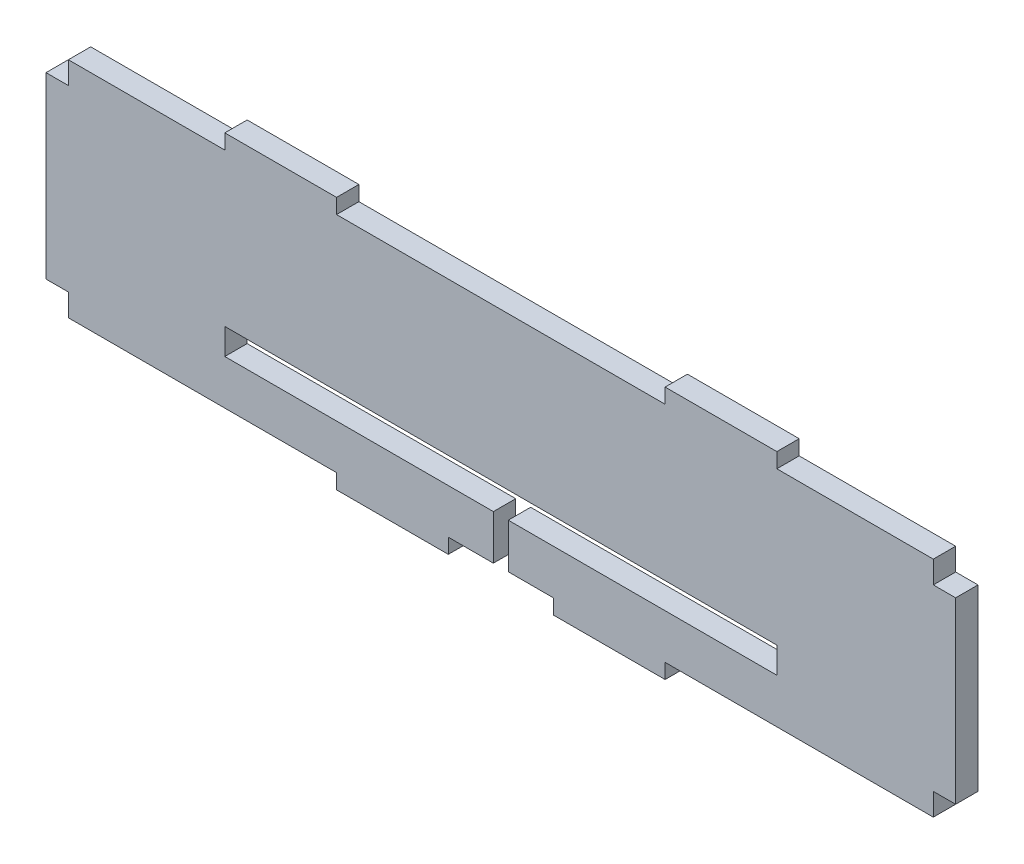
ISO-10303-21;
HEADER;
FILE_DESCRIPTION(('STEP AP214'),'2;1');
FILE_NAME('part.step','',(''),(''),'','','');
FILE_SCHEMA(('AUTOMOTIVE_DESIGN { 1 0 10303 214 1 1 1 1 }'));
ENDSEC;
DATA;
#1=APPLICATION_CONTEXT('core data for automotive mechanical design processes');
#2=APPLICATION_PROTOCOL_DEFINITION('international standard','automotive_design',2000,#1);
#3=PRODUCT_CONTEXT('',#1,'mechanical');
#4=PRODUCT('Part','Part','',(#3));
#5=PRODUCT_RELATED_PRODUCT_CATEGORY('part','',(#4));
#6=PRODUCT_DEFINITION_FORMATION('','',#4);
#7=PRODUCT_DEFINITION_CONTEXT('part definition',#1,'design');
#8=PRODUCT_DEFINITION('design','',#6,#7);
#9=PRODUCT_DEFINITION_SHAPE('','',#8);
#10=(LENGTH_UNIT() NAMED_UNIT(*) SI_UNIT(.MILLI.,.METRE.));
#11=(NAMED_UNIT(*) PLANE_ANGLE_UNIT() SI_UNIT($,.RADIAN.));
#12=(NAMED_UNIT(*) SI_UNIT($,.STERADIAN.) SOLID_ANGLE_UNIT());
#13=UNCERTAINTY_MEASURE_WITH_UNIT(LENGTH_MEASURE(1.E-05),#10,'distance_accuracy_value','');
#14=(GEOMETRIC_REPRESENTATION_CONTEXT(3) GLOBAL_UNCERTAINTY_ASSIGNED_CONTEXT((#13)) GLOBAL_UNIT_ASSIGNED_CONTEXT((#10,
#11,#12)) REPRESENTATION_CONTEXT('',''));
#15=CARTESIAN_POINT('',(0.,0.,0.));
#16=DIRECTION('',(0.,0.,1.));
#17=DIRECTION('',(1.,0.,0.));
#18=AXIS2_PLACEMENT_3D('',#15,#16,#17);
#19=CARTESIAN_POINT('',(0.,30.,3.));
#20=DIRECTION('',(0.,1.,0.));
#21=DIRECTION('',(0.,0.,1.));
#22=AXIS2_PLACEMENT_3D('',#19,#20,#21);
#23=PLANE('',#22);
#24=DIRECTION('',(1.,0.,0.));
#25=VECTOR('',#24,1.);
#26=CARTESIAN_POINT('',(0.,30.,0.));
#27=LINE('',#26,#25);
#28=CARTESIAN_POINT('',(6.00000000000002,30.,0.));
#29=VERTEX_POINT('',#28);
#30=CARTESIAN_POINT('',(27.,30.,0.));
#31=VERTEX_POINT('',#30);
#32=EDGE_CURVE('E298',#29,#31,#27,.T.);
#33=ORIENTED_EDGE('',*,*,#32,.F.);
#34=DIRECTION('',(0.,0.,-1.));
#35=VECTOR('',#34,1.);
#36=CARTESIAN_POINT('',(6.00000000000002,30.,3.));
#37=LINE('',#36,#35);
#38=CARTESIAN_POINT('',(6.00000000000002,30.,3.));
#39=VERTEX_POINT('',#38);
#40=EDGE_CURVE('E11',#39,#29,#37,.T.);
#41=ORIENTED_EDGE('',*,*,#40,.F.);
#42=DIRECTION('',(1.,0.,0.));
#43=VECTOR('',#42,1.);
#44=CARTESIAN_POINT('',(0.,30.,3.));
#45=LINE('',#44,#43);
#46=CARTESIAN_POINT('',(27.,30.,3.));
#47=VERTEX_POINT('',#46);
#48=EDGE_CURVE('E388',#39,#47,#45,.T.);
#49=ORIENTED_EDGE('',*,*,#48,.T.);
#50=DIRECTION('',(0.,0.,-1.));
#51=VECTOR('',#50,1.);
#52=CARTESIAN_POINT('',(27.,30.,3.));
#53=LINE('',#52,#51);
#54=EDGE_CURVE('E52',#47,#31,#53,.T.);
#55=ORIENTED_EDGE('',*,*,#54,.T.);
#56=EDGE_LOOP('',(#33,#41,#49,#55));
#57=FACE_BOUND('',#56,.T.);
#58=ADVANCED_FACE('F36',(#57),#23,.T.);
#59=CARTESIAN_POINT('',(6.00000000000002,0.,3.));
#60=DIRECTION('',(1.,0.,0.));
#61=DIRECTION('',(0.,0.,-1.));
#62=AXIS2_PLACEMENT_3D('',#59,#60,#61);
#63=PLANE('',#62);
#64=DIRECTION('',(0.,-1.,0.));
#65=VECTOR('',#64,1.);
#66=CARTESIAN_POINT('',(6.00000000000002,0.,0.));
#67=LINE('',#66,#65);
#68=CARTESIAN_POINT('',(6.00000000000002,27.,0.));
#69=VERTEX_POINT('',#68);
#70=EDGE_CURVE('E300',#29,#69,#67,.T.);
#71=ORIENTED_EDGE('',*,*,#70,.T.);
#72=DIRECTION('',(0.,0.,-1.));
#73=VECTOR('',#72,1.);
#74=CARTESIAN_POINT('',(6.00000000000002,27.,3.));
#75=LINE('',#74,#73);
#76=CARTESIAN_POINT('',(6.00000000000002,27.,3.));
#77=VERTEX_POINT('',#76);
#78=EDGE_CURVE('E44',#77,#69,#75,.T.);
#79=ORIENTED_EDGE('',*,*,#78,.F.);
#80=DIRECTION('',(0.,-1.,0.));
#81=VECTOR('',#80,1.);
#82=CARTESIAN_POINT('',(6.00000000000002,0.,3.));
#83=LINE('',#82,#81);
#84=EDGE_CURVE('E484',#39,#77,#83,.T.);
#85=ORIENTED_EDGE('',*,*,#84,.F.);
#86=ORIENTED_EDGE('',*,*,#40,.T.);
#87=EDGE_LOOP('',(#71,#79,#85,#86));
#88=FACE_BOUND('',#87,.T.);
#89=ADVANCED_FACE('F473',(#88),#63,.F.);
#90=CARTESIAN_POINT('',(0.,27.,3.));
#91=DIRECTION('',(0.,1.,0.));
#92=DIRECTION('',(0.,0.,1.));
#93=AXIS2_PLACEMENT_3D('',#90,#91,#92);
#94=PLANE('',#93);
#95=DIRECTION('',(1.,0.,0.));
#96=VECTOR('',#95,1.);
#97=CARTESIAN_POINT('',(0.,27.,0.));
#98=LINE('',#97,#96);
#99=CARTESIAN_POINT('',(3.00000000000002,27.,0.));
#100=VERTEX_POINT('',#99);
#101=EDGE_CURVE('E303',#100,#69,#98,.T.);
#102=ORIENTED_EDGE('',*,*,#101,.F.);
#103=DIRECTION('',(0.,0.,-1.));
#104=VECTOR('',#103,1.);
#105=CARTESIAN_POINT('',(3.00000000000002,27.,3.));
#106=LINE('',#105,#104);
#107=CARTESIAN_POINT('',(3.00000000000002,27.,3.));
#108=VERTEX_POINT('',#107);
#109=EDGE_CURVE('E463',#108,#100,#106,.T.);
#110=ORIENTED_EDGE('',*,*,#109,.F.);
#111=DIRECTION('',(1.,0.,0.));
#112=VECTOR('',#111,1.);
#113=CARTESIAN_POINT('',(0.,27.,3.));
#114=LINE('',#113,#112);
#115=EDGE_CURVE('E470',#108,#77,#114,.T.);
#116=ORIENTED_EDGE('',*,*,#115,.T.);
#117=ORIENTED_EDGE('',*,*,#78,.T.);
#118=EDGE_LOOP('',(#102,#110,#116,#117));
#119=FACE_BOUND('',#118,.T.);
#120=ADVANCED_FACE('F468',(#119),#94,.T.);
#121=CARTESIAN_POINT('',(3.00000000000002,0.,3.));
#122=DIRECTION('',(-1.,0.,0.));
#123=DIRECTION('',(0.,0.,1.));
#124=AXIS2_PLACEMENT_3D('',#121,#122,#123);
#125=PLANE('',#124);
#126=DIRECTION('',(0.,1.,0.));
#127=VECTOR('',#126,1.);
#128=CARTESIAN_POINT('',(3.00000000000002,0.,0.));
#129=LINE('',#128,#127);
#130=CARTESIAN_POINT('',(3.00000000000002,3.,0.));
#131=VERTEX_POINT('',#130);
#132=EDGE_CURVE('E306',#131,#100,#129,.T.);
#133=ORIENTED_EDGE('',*,*,#132,.F.);
#134=DIRECTION('',(0.,0.,-1.));
#135=VECTOR('',#134,1.);
#136=CARTESIAN_POINT('',(3.00000000000002,3.,3.));
#137=LINE('',#136,#135);
#138=CARTESIAN_POINT('',(3.00000000000002,3.,3.));
#139=VERTEX_POINT('',#138);
#140=EDGE_CURVE('E461',#139,#131,#137,.T.);
#141=ORIENTED_EDGE('',*,*,#140,.F.);
#142=DIRECTION('',(0.,1.,0.));
#143=VECTOR('',#142,1.);
#144=CARTESIAN_POINT('',(3.00000000000002,0.,3.));
#145=LINE('',#144,#143);
#146=EDGE_CURVE('E483',#139,#108,#145,.T.);
#147=ORIENTED_EDGE('',*,*,#146,.T.);
#148=ORIENTED_EDGE('',*,*,#109,.T.);
#149=EDGE_LOOP('',(#133,#141,#147,#148));
#150=FACE_BOUND('',#149,.T.);
#151=ADVANCED_FACE('F479',(#150),#125,.T.);
#152=CARTESIAN_POINT('',(0.,3.,3.));
#153=DIRECTION('',(0.,1.,0.));
#154=DIRECTION('',(0.,0.,1.));
#155=AXIS2_PLACEMENT_3D('',#152,#153,#154);
#156=PLANE('',#155);
#157=DIRECTION('',(1.,0.,0.));
#158=VECTOR('',#157,1.);
#159=CARTESIAN_POINT('',(0.,3.,0.));
#160=LINE('',#159,#158);
#161=CARTESIAN_POINT('',(6.00000000000002,3.,0.));
#162=VERTEX_POINT('',#161);
#163=EDGE_CURVE('E309',#131,#162,#160,.T.);
#164=ORIENTED_EDGE('',*,*,#163,.T.);
#165=DIRECTION('',(0.,0.,-1.));
#166=VECTOR('',#165,1.);
#167=CARTESIAN_POINT('',(6.00000000000002,3.,3.));
#168=LINE('',#167,#166);
#169=CARTESIAN_POINT('',(6.00000000000002,3.,3.));
#170=VERTEX_POINT('',#169);
#171=EDGE_CURVE('E459',#170,#162,#168,.T.);
#172=ORIENTED_EDGE('',*,*,#171,.F.);
#173=DIRECTION('',(1.,0.,0.));
#174=VECTOR('',#173,1.);
#175=CARTESIAN_POINT('',(0.,3.,3.));
#176=LINE('',#175,#174);
#177=EDGE_CURVE('E486',#139,#170,#176,.T.);
#178=ORIENTED_EDGE('',*,*,#177,.F.);
#179=ORIENTED_EDGE('',*,*,#140,.T.);
#180=EDGE_LOOP('',(#164,#172,#178,#179));
#181=FACE_BOUND('',#180,.T.);
#182=ADVANCED_FACE('F578',(#181),#156,.F.);
#183=CARTESIAN_POINT('',(6.00000000000002,0.,3.));
#184=DIRECTION('',(-1.,0.,0.));
#185=DIRECTION('',(0.,0.,1.));
#186=AXIS2_PLACEMENT_3D('',#183,#184,#185);
#187=PLANE('',#186);
#188=DIRECTION('',(0.,1.,0.));
#189=VECTOR('',#188,1.);
#190=CARTESIAN_POINT('',(6.00000000000002,0.,0.));
#191=LINE('',#190,#189);
#192=CARTESIAN_POINT('',(6.00000000000002,0.,0.));
#193=VERTEX_POINT('',#192);
#194=EDGE_CURVE('E312',#193,#162,#191,.T.);
#195=ORIENTED_EDGE('',*,*,#194,.F.);
#196=DIRECTION('',(0.,0.,-1.));
#197=VECTOR('',#196,1.);
#198=CARTESIAN_POINT('',(6.00000000000002,0.,3.));
#199=LINE('',#198,#197);
#200=CARTESIAN_POINT('',(6.00000000000002,0.,3.));
#201=VERTEX_POINT('',#200);
#202=EDGE_CURVE('E457',#201,#193,#199,.T.);
#203=ORIENTED_EDGE('',*,*,#202,.F.);
#204=DIRECTION('',(0.,1.,0.));
#205=VECTOR('',#204,1.);
#206=CARTESIAN_POINT('',(6.00000000000002,0.,3.));
#207=LINE('',#206,#205);
#208=EDGE_CURVE('E492',#201,#170,#207,.T.);
#209=ORIENTED_EDGE('',*,*,#208,.T.);
#210=ORIENTED_EDGE('',*,*,#171,.T.);
#211=EDGE_LOOP('',(#195,#203,#209,#210));
#212=FACE_BOUND('',#211,.T.);
#213=ADVANCED_FACE('F581',(#212),#187,.T.);
#214=CARTESIAN_POINT('',(0.,0.,3.));
#215=DIRECTION('',(0.,1.,0.));
#216=DIRECTION('',(0.,0.,1.));
#217=AXIS2_PLACEMENT_3D('',#214,#215,#216);
#218=PLANE('',#217);
#219=DIRECTION('',(1.,0.,0.));
#220=VECTOR('',#219,1.);
#221=CARTESIAN_POINT('',(0.,0.,0.));
#222=LINE('',#221,#220);
#223=CARTESIAN_POINT('',(42.,0.,0.));
#224=VERTEX_POINT('',#223);
#225=EDGE_CURVE('E315',#193,#224,#222,.T.);
#226=ORIENTED_EDGE('',*,*,#225,.T.);
#227=DIRECTION('',(0.,0.,-1.));
#228=VECTOR('',#227,1.);
#229=CARTESIAN_POINT('',(42.,0.,3.));
#230=LINE('',#229,#228);
#231=CARTESIAN_POINT('',(42.,0.,3.));
#232=VERTEX_POINT('',#231);
#233=EDGE_CURVE('E454',#232,#224,#230,.T.);
#234=ORIENTED_EDGE('',*,*,#233,.F.);
#235=DIRECTION('',(1.,0.,0.));
#236=VECTOR('',#235,1.);
#237=CARTESIAN_POINT('',(0.,0.,3.));
#238=LINE('',#237,#236);
#239=EDGE_CURVE('E495',#201,#232,#238,.T.);
#240=ORIENTED_EDGE('',*,*,#239,.F.);
#241=ORIENTED_EDGE('',*,*,#202,.T.);
#242=EDGE_LOOP('',(#226,#234,#240,#241));
#243=FACE_BOUND('',#242,.T.);
#244=ADVANCED_FACE('F585',(#243),#218,.F.);
#245=CARTESIAN_POINT('',(42.,2.91433543964104E-13,3.));
#246=DIRECTION('',(1.,0.,0.));
#247=DIRECTION('',(0.,1.,0.));
#248=AXIS2_PLACEMENT_3D('',#245,#246,#247);
#249=PLANE('',#248);
#250=DIRECTION('',(0.,-1.,0.));
#251=VECTOR('',#250,1.);
#252=CARTESIAN_POINT('',(42.,2.91433543964104E-13,0.));
#253=LINE('',#252,#251);
#254=CARTESIAN_POINT('',(42.,-2.,0.));
#255=VERTEX_POINT('',#254);
#256=EDGE_CURVE('E317',#224,#255,#253,.T.);
#257=ORIENTED_EDGE('',*,*,#256,.T.);
#258=DIRECTION('',(0.,0.,-1.));
#259=VECTOR('',#258,1.);
#260=CARTESIAN_POINT('',(42.,-2.,3.));
#261=LINE('',#260,#259);
#262=CARTESIAN_POINT('',(42.,-2.,3.));
#263=VERTEX_POINT('',#262);
#264=EDGE_CURVE('E451',#263,#255,#261,.T.);
#265=ORIENTED_EDGE('',*,*,#264,.F.);
#266=DIRECTION('',(0.,-1.,0.));
#267=VECTOR('',#266,1.);
#268=CARTESIAN_POINT('',(42.,2.91433543964104E-13,3.));
#269=LINE('',#268,#267);
#270=EDGE_CURVE('E497',#232,#263,#269,.T.);
#271=ORIENTED_EDGE('',*,*,#270,.F.);
#272=ORIENTED_EDGE('',*,*,#233,.T.);
#273=EDGE_LOOP('',(#257,#265,#271,#272));
#274=FACE_BOUND('',#273,.T.);
#275=ADVANCED_FACE('F589',(#274),#249,.F.);
#276=CARTESIAN_POINT('',(0.,-2.,3.));
#277=DIRECTION('',(0.,1.,0.));
#278=DIRECTION('',(-1.,0.,0.));
#279=AXIS2_PLACEMENT_3D('',#276,#277,#278);
#280=PLANE('',#279);
#281=DIRECTION('',(1.,0.,0.));
#282=VECTOR('',#281,1.);
#283=CARTESIAN_POINT('',(0.,-2.,0.));
#284=LINE('',#283,#282);
#285=CARTESIAN_POINT('',(57.,-2.,0.));
#286=VERTEX_POINT('',#285);
#287=EDGE_CURVE('E319',#255,#286,#284,.T.);
#288=ORIENTED_EDGE('',*,*,#287,.T.);
#289=DIRECTION('',(0.,0.,-1.));
#290=VECTOR('',#289,1.);
#291=CARTESIAN_POINT('',(57.,-2.,3.));
#292=LINE('',#291,#290);
#293=CARTESIAN_POINT('',(57.,-2.,3.));
#294=VERTEX_POINT('',#293);
#295=EDGE_CURVE('E448',#294,#286,#292,.T.);
#296=ORIENTED_EDGE('',*,*,#295,.F.);
#297=DIRECTION('',(1.,0.,0.));
#298=VECTOR('',#297,1.);
#299=CARTESIAN_POINT('',(0.,-2.,3.));
#300=LINE('',#299,#298);
#301=EDGE_CURVE('E499',#263,#294,#300,.T.);
#302=ORIENTED_EDGE('',*,*,#301,.F.);
#303=ORIENTED_EDGE('',*,*,#264,.T.);
#304=EDGE_LOOP('',(#288,#296,#302,#303));
#305=FACE_BOUND('',#304,.T.);
#306=ADVANCED_FACE('F593',(#305),#280,.F.);
#307=CARTESIAN_POINT('',(57.,0.,3.));
#308=DIRECTION('',(-1.,0.,0.));
#309=DIRECTION('',(0.,0.,1.));
#310=AXIS2_PLACEMENT_3D('',#307,#308,#309);
#311=PLANE('',#310);
#312=DIRECTION('',(0.,1.,0.));
#313=VECTOR('',#312,1.);
#314=CARTESIAN_POINT('',(57.,0.,0.));
#315=LINE('',#314,#313);
#316=CARTESIAN_POINT('',(57.,0.,0.));
#317=VERTEX_POINT('',#316);
#318=EDGE_CURVE('E321',#286,#317,#315,.T.);
#319=ORIENTED_EDGE('',*,*,#318,.T.);
#320=DIRECTION('',(0.,0.,-1.));
#321=VECTOR('',#320,1.);
#322=CARTESIAN_POINT('',(57.,0.,3.));
#323=LINE('',#322,#321);
#324=CARTESIAN_POINT('',(57.,0.,3.));
#325=VERTEX_POINT('',#324);
#326=EDGE_CURVE('E445',#325,#317,#323,.T.);
#327=ORIENTED_EDGE('',*,*,#326,.F.);
#328=DIRECTION('',(0.,1.,0.));
#329=VECTOR('',#328,1.);
#330=CARTESIAN_POINT('',(57.,0.,3.));
#331=LINE('',#330,#329);
#332=EDGE_CURVE('E501',#294,#325,#331,.T.);
#333=ORIENTED_EDGE('',*,*,#332,.F.);
#334=ORIENTED_EDGE('',*,*,#295,.T.);
#335=EDGE_LOOP('',(#319,#327,#333,#334));
#336=FACE_BOUND('',#335,.T.);
#337=ADVANCED_FACE('F597',(#336),#311,.F.);
#338=CARTESIAN_POINT('',(0.,0.,3.));
#339=DIRECTION('',(0.,1.,0.));
#340=DIRECTION('',(-1.,0.,0.));
#341=AXIS2_PLACEMENT_3D('',#338,#339,#340);
#342=PLANE('',#341);
#343=DIRECTION('',(1.,0.,0.));
#344=VECTOR('',#343,1.);
#345=CARTESIAN_POINT('',(0.,0.,0.));
#346=LINE('',#345,#344);
#347=CARTESIAN_POINT('',(63.05,0.,0.));
#348=VERTEX_POINT('',#347);
#349=EDGE_CURVE('E323',#317,#348,#346,.T.);
#350=ORIENTED_EDGE('',*,*,#349,.T.);
#351=DIRECTION('',(0.,0.,-1.));
#352=VECTOR('',#351,1.);
#353=CARTESIAN_POINT('',(63.05,0.,3.));
#354=LINE('',#353,#352);
#355=CARTESIAN_POINT('',(63.05,0.,3.));
#356=VERTEX_POINT('',#355);
#357=EDGE_CURVE('E442',#356,#348,#354,.T.);
#358=ORIENTED_EDGE('',*,*,#357,.F.);
#359=DIRECTION('',(1.,0.,0.));
#360=VECTOR('',#359,1.);
#361=CARTESIAN_POINT('',(0.,0.,3.));
#362=LINE('',#361,#360);
#363=EDGE_CURVE('E503',#325,#356,#362,.T.);
#364=ORIENTED_EDGE('',*,*,#363,.F.);
#365=ORIENTED_EDGE('',*,*,#326,.T.);
#366=EDGE_LOOP('',(#350,#358,#364,#365));
#367=FACE_BOUND('',#366,.T.);
#368=ADVANCED_FACE('F601',(#367),#342,.F.);
#369=CARTESIAN_POINT('',(63.05,0.,3.));
#370=DIRECTION('',(-1.,0.,0.));
#371=DIRECTION('',(0.,0.,1.));
#372=AXIS2_PLACEMENT_3D('',#369,#370,#371);
#373=PLANE('',#372);
#374=DIRECTION('',(0.,1.,0.));
#375=VECTOR('',#374,1.);
#376=CARTESIAN_POINT('',(63.05,0.,0.));
#377=LINE('',#376,#375);
#378=CARTESIAN_POINT('',(63.05,6.,0.));
#379=VERTEX_POINT('',#378);
#380=EDGE_CURVE('E325',#348,#379,#377,.T.);
#381=ORIENTED_EDGE('',*,*,#380,.T.);
#382=DIRECTION('',(0.,0.,-1.));
#383=VECTOR('',#382,1.);
#384=CARTESIAN_POINT('',(63.05,6.,3.));
#385=LINE('',#384,#383);
#386=CARTESIAN_POINT('',(63.05,6.,3.));
#387=VERTEX_POINT('',#386);
#388=EDGE_CURVE('E440',#387,#379,#385,.T.);
#389=ORIENTED_EDGE('',*,*,#388,.F.);
#390=DIRECTION('',(0.,1.,0.));
#391=VECTOR('',#390,1.);
#392=CARTESIAN_POINT('',(63.05,0.,3.));
#393=LINE('',#392,#391);
#394=EDGE_CURVE('E505',#356,#387,#393,.T.);
#395=ORIENTED_EDGE('',*,*,#394,.F.);
#396=ORIENTED_EDGE('',*,*,#357,.T.);
#397=EDGE_LOOP('',(#381,#389,#395,#396));
#398=FACE_BOUND('',#397,.T.);
#399=ADVANCED_FACE('F603',(#398),#373,.F.);
#400=CARTESIAN_POINT('',(0.,6.,3.));
#401=DIRECTION('',(0.,1.,0.));
#402=DIRECTION('',(0.,0.,1.));
#403=AXIS2_PLACEMENT_3D('',#400,#401,#402);
#404=PLANE('',#403);
#405=DIRECTION('',(1.,0.,0.));
#406=VECTOR('',#405,1.);
#407=CARTESIAN_POINT('',(0.,6.,0.));
#408=LINE('',#407,#406);
#409=CARTESIAN_POINT('',(27.,6.,0.));
#410=VERTEX_POINT('',#409);
#411=EDGE_CURVE('E329',#410,#379,#408,.T.);
#412=ORIENTED_EDGE('',*,*,#411,.F.);
#413=DIRECTION('',(0.,0.,-1.));
#414=VECTOR('',#413,1.);
#415=CARTESIAN_POINT('',(27.,6.,3.));
#416=LINE('',#415,#414);
#417=CARTESIAN_POINT('',(27.,6.,3.));
#418=VERTEX_POINT('',#417);
#419=EDGE_CURVE('E438',#418,#410,#416,.T.);
#420=ORIENTED_EDGE('',*,*,#419,.F.);
#421=DIRECTION('',(1.,0.,0.));
#422=VECTOR('',#421,1.);
#423=CARTESIAN_POINT('',(0.,6.,3.));
#424=LINE('',#423,#422);
#425=EDGE_CURVE('E508',#418,#387,#424,.T.);
#426=ORIENTED_EDGE('',*,*,#425,.T.);
#427=ORIENTED_EDGE('',*,*,#388,.T.);
#428=EDGE_LOOP('',(#412,#420,#426,#427));
#429=FACE_BOUND('',#428,.T.);
#430=ADVANCED_FACE('F606',(#429),#404,.T.);
#431=CARTESIAN_POINT('',(27.,0.,3.));
#432=DIRECTION('',(1.,0.,0.));
#433=DIRECTION('',(0.,0.,-1.));
#434=AXIS2_PLACEMENT_3D('',#431,#432,#433);
#435=PLANE('',#434);
#436=DIRECTION('',(0.,-1.,0.));
#437=VECTOR('',#436,1.);
#438=CARTESIAN_POINT('',(27.,0.,0.));
#439=LINE('',#438,#437);
#440=CARTESIAN_POINT('',(27.,9.5,0.));
#441=VERTEX_POINT('',#440);
#442=EDGE_CURVE('E332',#441,#410,#439,.T.);
#443=ORIENTED_EDGE('',*,*,#442,.F.);
#444=DIRECTION('',(0.,0.,-1.));
#445=VECTOR('',#444,1.);
#446=CARTESIAN_POINT('',(27.,9.5,3.));
#447=LINE('',#446,#445);
#448=CARTESIAN_POINT('',(27.,9.5,3.));
#449=VERTEX_POINT('',#448);
#450=EDGE_CURVE('E436',#449,#441,#447,.T.);
#451=ORIENTED_EDGE('',*,*,#450,.F.);
#452=DIRECTION('',(0.,-1.,0.));
#453=VECTOR('',#452,1.);
#454=CARTESIAN_POINT('',(27.,0.,3.));
#455=LINE('',#454,#453);
#456=EDGE_CURVE('E511',#449,#418,#455,.T.);
#457=ORIENTED_EDGE('',*,*,#456,.T.);
#458=ORIENTED_EDGE('',*,*,#419,.T.);
#459=EDGE_LOOP('',(#443,#451,#457,#458));
#460=FACE_BOUND('',#459,.T.);
#461=ADVANCED_FACE('F610',(#460),#435,.T.);
#462=CARTESIAN_POINT('',(0.,9.5,3.));
#463=DIRECTION('',(0.,1.,0.));
#464=DIRECTION('',(0.,0.,1.));
#465=AXIS2_PLACEMENT_3D('',#462,#463,#464);
#466=PLANE('',#465);
#467=DIRECTION('',(1.,0.,0.));
#468=VECTOR('',#467,1.);
#469=CARTESIAN_POINT('',(0.,9.5,0.));
#470=LINE('',#469,#468);
#471=CARTESIAN_POINT('',(101.1,9.5,0.));
#472=VERTEX_POINT('',#471);
#473=EDGE_CURVE('E335',#441,#472,#470,.T.);
#474=ORIENTED_EDGE('',*,*,#473,.T.);
#475=DIRECTION('',(0.,0.,-1.));
#476=VECTOR('',#475,1.);
#477=CARTESIAN_POINT('',(101.1,9.5,3.));
#478=LINE('',#477,#476);
#479=CARTESIAN_POINT('',(101.1,9.5,3.));
#480=VERTEX_POINT('',#479);
#481=EDGE_CURVE('E433',#480,#472,#478,.T.);
#482=ORIENTED_EDGE('',*,*,#481,.F.);
#483=DIRECTION('',(1.,0.,0.));
#484=VECTOR('',#483,1.);
#485=CARTESIAN_POINT('',(0.,9.5,3.));
#486=LINE('',#485,#484);
#487=EDGE_CURVE('E514',#449,#480,#486,.T.);
#488=ORIENTED_EDGE('',*,*,#487,.F.);
#489=ORIENTED_EDGE('',*,*,#450,.T.);
#490=EDGE_LOOP('',(#474,#482,#488,#489));
#491=FACE_BOUND('',#490,.T.);
#492=ADVANCED_FACE('F614',(#491),#466,.F.);
#493=CARTESIAN_POINT('',(101.1,-4.00869813534298E-13,3.));
#494=DIRECTION('',(1.,0.,0.));
#495=DIRECTION('',(0.,1.,0.));
#496=AXIS2_PLACEMENT_3D('',#493,#494,#495);
#497=PLANE('',#496);
#498=DIRECTION('',(0.,-1.,0.));
#499=VECTOR('',#498,1.);
#500=CARTESIAN_POINT('',(101.1,-4.00869813534298E-13,0.));
#501=LINE('',#500,#499);
#502=CARTESIAN_POINT('',(101.1,6.,0.));
#503=VERTEX_POINT('',#502);
#504=EDGE_CURVE('E337',#472,#503,#501,.T.);
#505=ORIENTED_EDGE('',*,*,#504,.T.);
#506=DIRECTION('',(0.,0.,-1.));
#507=VECTOR('',#506,1.);
#508=CARTESIAN_POINT('',(101.1,6.,3.));
#509=LINE('',#508,#507);
#510=CARTESIAN_POINT('',(101.1,6.,3.));
#511=VERTEX_POINT('',#510);
#512=EDGE_CURVE('E431',#511,#503,#509,.T.);
#513=ORIENTED_EDGE('',*,*,#512,.F.);
#514=DIRECTION('',(0.,-1.,0.));
#515=VECTOR('',#514,1.);
#516=CARTESIAN_POINT('',(101.1,-4.00869813534298E-13,3.));
#517=LINE('',#516,#515);
#518=EDGE_CURVE('E516',#480,#511,#517,.T.);
#519=ORIENTED_EDGE('',*,*,#518,.F.);
#520=ORIENTED_EDGE('',*,*,#481,.T.);
#521=EDGE_LOOP('',(#505,#513,#519,#520));
#522=FACE_BOUND('',#521,.T.);
#523=ADVANCED_FACE('F618',(#522),#497,.F.);
#524=CARTESIAN_POINT('',(0.,6.,3.));
#525=DIRECTION('',(0.,1.,0.));
#526=DIRECTION('',(0.,0.,1.));
#527=AXIS2_PLACEMENT_3D('',#524,#525,#526);
#528=PLANE('',#527);
#529=DIRECTION('',(1.,0.,0.));
#530=VECTOR('',#529,1.);
#531=CARTESIAN_POINT('',(0.,6.,0.));
#532=LINE('',#531,#530);
#533=CARTESIAN_POINT('',(65.05,6.,0.));
#534=VERTEX_POINT('',#533);
#535=EDGE_CURVE('E340',#534,#503,#532,.T.);
#536=ORIENTED_EDGE('',*,*,#535,.F.);
#537=DIRECTION('',(0.,0.,-1.));
#538=VECTOR('',#537,1.);
#539=CARTESIAN_POINT('',(65.05,6.,3.));
#540=LINE('',#539,#538);
#541=CARTESIAN_POINT('',(65.05,6.,3.));
#542=VERTEX_POINT('',#541);
#543=EDGE_CURVE('E429',#542,#534,#540,.T.);
#544=ORIENTED_EDGE('',*,*,#543,.F.);
#545=DIRECTION('',(1.,0.,0.));
#546=VECTOR('',#545,1.);
#547=CARTESIAN_POINT('',(0.,6.,3.));
#548=LINE('',#547,#546);
#549=EDGE_CURVE('E518',#542,#511,#548,.T.);
#550=ORIENTED_EDGE('',*,*,#549,.T.);
#551=ORIENTED_EDGE('',*,*,#512,.T.);
#552=EDGE_LOOP('',(#536,#544,#550,#551));
#553=FACE_BOUND('',#552,.T.);
#554=ADVANCED_FACE('F622',(#553),#528,.T.);
#555=CARTESIAN_POINT('',(65.05,0.,3.));
#556=DIRECTION('',(-1.,0.,0.));
#557=DIRECTION('',(0.,0.,1.));
#558=AXIS2_PLACEMENT_3D('',#555,#556,#557);
#559=PLANE('',#558);
#560=DIRECTION('',(0.,1.,0.));
#561=VECTOR('',#560,1.);
#562=CARTESIAN_POINT('',(65.05,0.,0.));
#563=LINE('',#562,#561);
#564=CARTESIAN_POINT('',(65.05,0.,0.));
#565=VERTEX_POINT('',#564);
#566=EDGE_CURVE('E343',#565,#534,#563,.T.);
#567=ORIENTED_EDGE('',*,*,#566,.F.);
#568=DIRECTION('',(0.,0.,-1.));
#569=VECTOR('',#568,1.);
#570=CARTESIAN_POINT('',(65.05,0.,3.));
#571=LINE('',#570,#569);
#572=CARTESIAN_POINT('',(65.05,0.,3.));
#573=VERTEX_POINT('',#572);
#574=EDGE_CURVE('E427',#573,#565,#571,.T.);
#575=ORIENTED_EDGE('',*,*,#574,.F.);
#576=DIRECTION('',(0.,1.,0.));
#577=VECTOR('',#576,1.);
#578=CARTESIAN_POINT('',(65.05,0.,3.));
#579=LINE('',#578,#577);
#580=EDGE_CURVE('E521',#573,#542,#579,.T.);
#581=ORIENTED_EDGE('',*,*,#580,.T.);
#582=ORIENTED_EDGE('',*,*,#543,.T.);
#583=EDGE_LOOP('',(#567,#575,#581,#582));
#584=FACE_BOUND('',#583,.T.);
#585=ADVANCED_FACE('F626',(#584),#559,.T.);
#586=CARTESIAN_POINT('',(71.1,0.,0.));
#587=VERTEX_POINT('',#586);
#588=EDGE_CURVE('E326',#565,#587,#346,.T.);
#589=ORIENTED_EDGE('',*,*,#588,.T.);
#590=DIRECTION('',(0.,0.,-1.));
#591=VECTOR('',#590,1.);
#592=CARTESIAN_POINT('',(71.1,0.,3.));
#593=LINE('',#592,#591);
#594=CARTESIAN_POINT('',(71.1,0.,3.));
#595=VERTEX_POINT('',#594);
#596=EDGE_CURVE('E424',#595,#587,#593,.T.);
#597=ORIENTED_EDGE('',*,*,#596,.F.);
#598=EDGE_CURVE('E506',#573,#595,#362,.T.);
#599=ORIENTED_EDGE('',*,*,#598,.F.);
#600=ORIENTED_EDGE('',*,*,#574,.T.);
#601=EDGE_LOOP('',(#589,#597,#599,#600));
#602=FACE_BOUND('',#601,.T.);
#603=ADVANCED_FACE('F630',(#602),#342,.F.);
#604=CARTESIAN_POINT('',(71.1,0.,3.));
#605=DIRECTION('',(1.,0.,0.));
#606=DIRECTION('',(0.,0.,-1.));
#607=AXIS2_PLACEMENT_3D('',#604,#605,#606);
#608=PLANE('',#607);
#609=DIRECTION('',(0.,-1.,0.));
#610=VECTOR('',#609,1.);
#611=CARTESIAN_POINT('',(71.1,0.,0.));
#612=LINE('',#611,#610);
#613=CARTESIAN_POINT('',(71.1,-1.99999999999999,0.));
#614=VERTEX_POINT('',#613);
#615=EDGE_CURVE('E346',#587,#614,#612,.T.);
#616=ORIENTED_EDGE('',*,*,#615,.T.);
#617=DIRECTION('',(0.,0.,-1.));
#618=VECTOR('',#617,1.);
#619=CARTESIAN_POINT('',(71.1,-1.99999999999999,3.));
#620=LINE('',#619,#618);
#621=CARTESIAN_POINT('',(71.1,-1.99999999999999,3.));
#622=VERTEX_POINT('',#621);
#623=EDGE_CURVE('E421',#622,#614,#620,.T.);
#624=ORIENTED_EDGE('',*,*,#623,.F.);
#625=DIRECTION('',(0.,-1.,0.));
#626=VECTOR('',#625,1.);
#627=CARTESIAN_POINT('',(71.1,0.,3.));
#628=LINE('',#627,#626);
#629=EDGE_CURVE('E524',#595,#622,#628,.T.);
#630=ORIENTED_EDGE('',*,*,#629,.F.);
#631=ORIENTED_EDGE('',*,*,#596,.T.);
#632=EDGE_LOOP('',(#616,#624,#630,#631));
#633=FACE_BOUND('',#632,.T.);
#634=ADVANCED_FACE('F634',(#633),#608,.F.);
#635=CARTESIAN_POINT('',(0.,-2.,3.));
#636=DIRECTION('',(0.,1.,0.));
#637=DIRECTION('',(-1.,0.,0.));
#638=AXIS2_PLACEMENT_3D('',#635,#636,#637);
#639=PLANE('',#638);
#640=DIRECTION('',(1.,0.,0.));
#641=VECTOR('',#640,1.);
#642=CARTESIAN_POINT('',(0.,-2.,0.));
#643=LINE('',#642,#641);
#644=CARTESIAN_POINT('',(86.1,-1.99999999999998,0.));
#645=VERTEX_POINT('',#644);
#646=EDGE_CURVE('E348',#614,#645,#643,.T.);
#647=ORIENTED_EDGE('',*,*,#646,.T.);
#648=DIRECTION('',(0.,0.,-1.));
#649=VECTOR('',#648,1.);
#650=CARTESIAN_POINT('',(86.1,-1.99999999999998,3.));
#651=LINE('',#650,#649);
#652=CARTESIAN_POINT('',(86.1,-1.99999999999998,3.));
#653=VERTEX_POINT('',#652);
#654=EDGE_CURVE('E418',#653,#645,#651,.T.);
#655=ORIENTED_EDGE('',*,*,#654,.F.);
#656=DIRECTION('',(1.,0.,0.));
#657=VECTOR('',#656,1.);
#658=CARTESIAN_POINT('',(0.,-2.,3.));
#659=LINE('',#658,#657);
#660=EDGE_CURVE('E526',#622,#653,#659,.T.);
#661=ORIENTED_EDGE('',*,*,#660,.F.);
#662=ORIENTED_EDGE('',*,*,#623,.T.);
#663=EDGE_LOOP('',(#647,#655,#661,#662));
#664=FACE_BOUND('',#663,.T.);
#665=ADVANCED_FACE('F638',(#664),#639,.F.);
#666=CARTESIAN_POINT('',(86.1,0.,3.));
#667=DIRECTION('',(-1.,0.,0.));
#668=DIRECTION('',(0.,0.,1.));
#669=AXIS2_PLACEMENT_3D('',#666,#667,#668);
#670=PLANE('',#669);
#671=DIRECTION('',(0.,1.,0.));
#672=VECTOR('',#671,1.);
#673=CARTESIAN_POINT('',(86.1,0.,0.));
#674=LINE('',#673,#672);
#675=CARTESIAN_POINT('',(86.1,0.,0.));
#676=VERTEX_POINT('',#675);
#677=EDGE_CURVE('E350',#645,#676,#674,.T.);
#678=ORIENTED_EDGE('',*,*,#677,.T.);
#679=DIRECTION('',(0.,0.,-1.));
#680=VECTOR('',#679,1.);
#681=CARTESIAN_POINT('',(86.1,0.,3.));
#682=LINE('',#681,#680);
#683=CARTESIAN_POINT('',(86.1,0.,3.));
#684=VERTEX_POINT('',#683);
#685=EDGE_CURVE('E415',#684,#676,#682,.T.);
#686=ORIENTED_EDGE('',*,*,#685,.F.);
#687=DIRECTION('',(0.,1.,0.));
#688=VECTOR('',#687,1.);
#689=CARTESIAN_POINT('',(86.1,0.,3.));
#690=LINE('',#689,#688);
#691=EDGE_CURVE('E528',#653,#684,#690,.T.);
#692=ORIENTED_EDGE('',*,*,#691,.F.);
#693=ORIENTED_EDGE('',*,*,#654,.T.);
#694=EDGE_LOOP('',(#678,#686,#692,#693));
#695=FACE_BOUND('',#694,.T.);
#696=ADVANCED_FACE('F642',(#695),#670,.F.);
#697=CARTESIAN_POINT('',(0.,0.,3.));
#698=DIRECTION('',(0.,1.,0.));
#699=DIRECTION('',(-1.,0.,0.));
#700=AXIS2_PLACEMENT_3D('',#697,#698,#699);
#701=PLANE('',#700);
#702=DIRECTION('',(1.,0.,0.));
#703=VECTOR('',#702,1.);
#704=CARTESIAN_POINT('',(0.,0.,0.));
#705=LINE('',#704,#703);
#706=CARTESIAN_POINT('',(122.1,0.,0.));
#707=VERTEX_POINT('',#706);
#708=EDGE_CURVE('E352',#676,#707,#705,.T.);
#709=ORIENTED_EDGE('',*,*,#708,.T.);
#710=DIRECTION('',(0.,0.,-1.));
#711=VECTOR('',#710,1.);
#712=CARTESIAN_POINT('',(122.1,0.,3.));
#713=LINE('',#712,#711);
#714=CARTESIAN_POINT('',(122.1,0.,3.));
#715=VERTEX_POINT('',#714);
#716=EDGE_CURVE('E412',#715,#707,#713,.T.);
#717=ORIENTED_EDGE('',*,*,#716,.F.);
#718=DIRECTION('',(1.,0.,0.));
#719=VECTOR('',#718,1.);
#720=CARTESIAN_POINT('',(0.,0.,3.));
#721=LINE('',#720,#719);
#722=EDGE_CURVE('E530',#684,#715,#721,.T.);
#723=ORIENTED_EDGE('',*,*,#722,.F.);
#724=ORIENTED_EDGE('',*,*,#685,.T.);
#725=EDGE_LOOP('',(#709,#717,#723,#724));
#726=FACE_BOUND('',#725,.T.);
#727=ADVANCED_FACE('F646',(#726),#701,.F.);
#728=CARTESIAN_POINT('',(122.1,0.,3.));
#729=DIRECTION('',(-1.,0.,0.));
#730=DIRECTION('',(0.,0.,1.));
#731=AXIS2_PLACEMENT_3D('',#728,#729,#730);
#732=PLANE('',#731);
#733=DIRECTION('',(0.,1.,0.));
#734=VECTOR('',#733,1.);
#735=CARTESIAN_POINT('',(122.1,0.,0.));
#736=LINE('',#735,#734);
#737=CARTESIAN_POINT('',(122.1,3.,0.));
#738=VERTEX_POINT('',#737);
#739=EDGE_CURVE('E354',#707,#738,#736,.T.);
#740=ORIENTED_EDGE('',*,*,#739,.T.);
#741=DIRECTION('',(0.,0.,-1.));
#742=VECTOR('',#741,1.);
#743=CARTESIAN_POINT('',(122.1,3.,3.));
#744=LINE('',#743,#742);
#745=CARTESIAN_POINT('',(122.1,3.,3.));
#746=VERTEX_POINT('',#745);
#747=EDGE_CURVE('E410',#746,#738,#744,.T.);
#748=ORIENTED_EDGE('',*,*,#747,.F.);
#749=DIRECTION('',(0.,1.,0.));
#750=VECTOR('',#749,1.);
#751=CARTESIAN_POINT('',(122.1,0.,3.));
#752=LINE('',#751,#750);
#753=EDGE_CURVE('E532',#715,#746,#752,.T.);
#754=ORIENTED_EDGE('',*,*,#753,.F.);
#755=ORIENTED_EDGE('',*,*,#716,.T.);
#756=EDGE_LOOP('',(#740,#748,#754,#755));
#757=FACE_BOUND('',#756,.T.);
#758=ADVANCED_FACE('F650',(#757),#732,.F.);
#759=CARTESIAN_POINT('',(0.,3.,3.));
#760=DIRECTION('',(0.,-1.,0.));
#761=DIRECTION('',(0.,0.,-1.));
#762=AXIS2_PLACEMENT_3D('',#759,#760,#761);
#763=PLANE('',#762);
#764=DIRECTION('',(-1.,0.,0.));
#765=VECTOR('',#764,1.);
#766=CARTESIAN_POINT('',(0.,3.,0.));
#767=LINE('',#766,#765);
#768=CARTESIAN_POINT('',(125.1,3.,0.));
#769=VERTEX_POINT('',#768);
#770=EDGE_CURVE('E357',#769,#738,#767,.T.);
#771=ORIENTED_EDGE('',*,*,#770,.F.);
#772=DIRECTION('',(0.,0.,-1.));
#773=VECTOR('',#772,1.);
#774=CARTESIAN_POINT('',(125.1,3.,3.));
#775=LINE('',#774,#773);
#776=CARTESIAN_POINT('',(125.1,3.,3.));
#777=VERTEX_POINT('',#776);
#778=EDGE_CURVE('E408',#777,#769,#775,.T.);
#779=ORIENTED_EDGE('',*,*,#778,.F.);
#780=DIRECTION('',(-1.,0.,0.));
#781=VECTOR('',#780,1.);
#782=CARTESIAN_POINT('',(0.,3.,3.));
#783=LINE('',#782,#781);
#784=EDGE_CURVE('E534',#777,#746,#783,.T.);
#785=ORIENTED_EDGE('',*,*,#784,.T.);
#786=ORIENTED_EDGE('',*,*,#747,.T.);
#787=EDGE_LOOP('',(#771,#779,#785,#786));
#788=FACE_BOUND('',#787,.T.);
#789=ADVANCED_FACE('F654',(#788),#763,.T.);
#790=CARTESIAN_POINT('',(125.1,0.,3.));
#791=DIRECTION('',(-1.,0.,0.));
#792=DIRECTION('',(0.,0.,1.));
#793=AXIS2_PLACEMENT_3D('',#790,#791,#792);
#794=PLANE('',#793);
#795=DIRECTION('',(0.,1.,0.));
#796=VECTOR('',#795,1.);
#797=CARTESIAN_POINT('',(125.1,0.,0.));
#798=LINE('',#797,#796);
#799=CARTESIAN_POINT('',(125.1,27.,0.));
#800=VERTEX_POINT('',#799);
#801=EDGE_CURVE('E360',#769,#800,#798,.T.);
#802=ORIENTED_EDGE('',*,*,#801,.T.);
#803=DIRECTION('',(0.,0.,-1.));
#804=VECTOR('',#803,1.);
#805=CARTESIAN_POINT('',(125.1,27.,3.));
#806=LINE('',#805,#804);
#807=CARTESIAN_POINT('',(125.1,27.,3.));
#808=VERTEX_POINT('',#807);
#809=EDGE_CURVE('E405',#808,#800,#806,.T.);
#810=ORIENTED_EDGE('',*,*,#809,.F.);
#811=DIRECTION('',(0.,1.,0.));
#812=VECTOR('',#811,1.);
#813=CARTESIAN_POINT('',(125.1,0.,3.));
#814=LINE('',#813,#812);
#815=EDGE_CURVE('E537',#777,#808,#814,.T.);
#816=ORIENTED_EDGE('',*,*,#815,.F.);
#817=ORIENTED_EDGE('',*,*,#778,.T.);
#818=EDGE_LOOP('',(#802,#810,#816,#817));
#819=FACE_BOUND('',#818,.T.);
#820=ADVANCED_FACE('F658',(#819),#794,.F.);
#821=CARTESIAN_POINT('',(0.,27.,3.));
#822=DIRECTION('',(0.,-1.,0.));
#823=DIRECTION('',(0.,0.,-1.));
#824=AXIS2_PLACEMENT_3D('',#821,#822,#823);
#825=PLANE('',#824);
#826=DIRECTION('',(-1.,0.,0.));
#827=VECTOR('',#826,1.);
#828=CARTESIAN_POINT('',(0.,27.,0.));
#829=LINE('',#828,#827);
#830=CARTESIAN_POINT('',(122.1,27.,0.));
#831=VERTEX_POINT('',#830);
#832=EDGE_CURVE('E362',#800,#831,#829,.T.);
#833=ORIENTED_EDGE('',*,*,#832,.T.);
#834=DIRECTION('',(0.,0.,-1.));
#835=VECTOR('',#834,1.);
#836=CARTESIAN_POINT('',(122.1,27.,3.));
#837=LINE('',#836,#835);
#838=CARTESIAN_POINT('',(122.1,27.,3.));
#839=VERTEX_POINT('',#838);
#840=EDGE_CURVE('E403',#839,#831,#837,.T.);
#841=ORIENTED_EDGE('',*,*,#840,.F.);
#842=DIRECTION('',(-1.,0.,0.));
#843=VECTOR('',#842,1.);
#844=CARTESIAN_POINT('',(0.,27.,3.));
#845=LINE('',#844,#843);
#846=EDGE_CURVE('E539',#808,#839,#845,.T.);
#847=ORIENTED_EDGE('',*,*,#846,.F.);
#848=ORIENTED_EDGE('',*,*,#809,.T.);
#849=EDGE_LOOP('',(#833,#841,#847,#848));
#850=FACE_BOUND('',#849,.T.);
#851=ADVANCED_FACE('F662',(#850),#825,.F.);
#852=CARTESIAN_POINT('',(122.1,0.,3.));
#853=DIRECTION('',(1.,0.,0.));
#854=DIRECTION('',(0.,0.,-1.));
#855=AXIS2_PLACEMENT_3D('',#852,#853,#854);
#856=PLANE('',#855);
#857=DIRECTION('',(0.,-1.,0.));
#858=VECTOR('',#857,1.);
#859=CARTESIAN_POINT('',(122.1,0.,0.));
#860=LINE('',#859,#858);
#861=CARTESIAN_POINT('',(122.1,30.,0.));
#862=VERTEX_POINT('',#861);
#863=EDGE_CURVE('E365',#862,#831,#860,.T.);
#864=ORIENTED_EDGE('',*,*,#863,.F.);
#865=DIRECTION('',(0.,0.,-1.));
#866=VECTOR('',#865,1.);
#867=CARTESIAN_POINT('',(122.1,30.,3.));
#868=LINE('',#867,#866);
#869=CARTESIAN_POINT('',(122.1,30.,3.));
#870=VERTEX_POINT('',#869);
#871=EDGE_CURVE('E401',#870,#862,#868,.T.);
#872=ORIENTED_EDGE('',*,*,#871,.F.);
#873=DIRECTION('',(0.,-1.,0.));
#874=VECTOR('',#873,1.);
#875=CARTESIAN_POINT('',(122.1,0.,3.));
#876=LINE('',#875,#874);
#877=EDGE_CURVE('E541',#870,#839,#876,.T.);
#878=ORIENTED_EDGE('',*,*,#877,.T.);
#879=ORIENTED_EDGE('',*,*,#840,.T.);
#880=EDGE_LOOP('',(#864,#872,#878,#879));
#881=FACE_BOUND('',#880,.T.);
#882=ADVANCED_FACE('F666',(#881),#856,.T.);
#883=CARTESIAN_POINT('',(0.,30.,3.));
#884=DIRECTION('',(0.,-1.,0.));
#885=DIRECTION('',(0.,0.,-1.));
#886=AXIS2_PLACEMENT_3D('',#883,#884,#885);
#887=PLANE('',#886);
#888=DIRECTION('',(-1.,0.,0.));
#889=VECTOR('',#888,1.);
#890=CARTESIAN_POINT('',(0.,30.,0.));
#891=LINE('',#890,#889);
#892=CARTESIAN_POINT('',(101.1,30.,0.));
#893=VERTEX_POINT('',#892);
#894=EDGE_CURVE('E368',#862,#893,#891,.T.);
#895=ORIENTED_EDGE('',*,*,#894,.T.);
#896=DIRECTION('',(0.,0.,-1.));
#897=VECTOR('',#896,1.);
#898=CARTESIAN_POINT('',(101.1,30.,3.));
#899=LINE('',#898,#897);
#900=CARTESIAN_POINT('',(101.1,30.,3.));
#901=VERTEX_POINT('',#900);
#902=EDGE_CURVE('E398',#901,#893,#899,.T.);
#903=ORIENTED_EDGE('',*,*,#902,.F.);
#904=DIRECTION('',(-1.,0.,0.));
#905=VECTOR('',#904,1.);
#906=CARTESIAN_POINT('',(0.,30.,3.));
#907=LINE('',#906,#905);
#908=EDGE_CURVE('E544',#870,#901,#907,.T.);
#909=ORIENTED_EDGE('',*,*,#908,.F.);
#910=ORIENTED_EDGE('',*,*,#871,.T.);
#911=EDGE_LOOP('',(#895,#903,#909,#910));
#912=FACE_BOUND('',#911,.T.);
#913=ADVANCED_FACE('F670',(#912),#887,.F.);
#914=CARTESIAN_POINT('',(101.1,7.01522173685024E-13,3.));
#915=DIRECTION('',(-1.,0.,0.));
#916=DIRECTION('',(0.,-1.,0.));
#917=AXIS2_PLACEMENT_3D('',#914,#915,#916);
#918=PLANE('',#917);
#919=DIRECTION('',(0.,1.,0.));
#920=VECTOR('',#919,1.);
#921=CARTESIAN_POINT('',(101.1,7.01522173685024E-13,0.));
#922=LINE('',#921,#920);
#923=CARTESIAN_POINT('',(101.1,32.,0.));
#924=VERTEX_POINT('',#923);
#925=EDGE_CURVE('E370',#893,#924,#922,.T.);
#926=ORIENTED_EDGE('',*,*,#925,.T.);
#927=DIRECTION('',(0.,0.,-1.));
#928=VECTOR('',#927,1.);
#929=CARTESIAN_POINT('',(101.1,32.,3.));
#930=LINE('',#929,#928);
#931=CARTESIAN_POINT('',(101.1,32.,3.));
#932=VERTEX_POINT('',#931);
#933=EDGE_CURVE('E396',#932,#924,#930,.T.);
#934=ORIENTED_EDGE('',*,*,#933,.F.);
#935=DIRECTION('',(0.,1.,0.));
#936=VECTOR('',#935,1.);
#937=CARTESIAN_POINT('',(101.1,7.01522173685024E-13,3.));
#938=LINE('',#937,#936);
#939=EDGE_CURVE('E546',#901,#932,#938,.T.);
#940=ORIENTED_EDGE('',*,*,#939,.F.);
#941=ORIENTED_EDGE('',*,*,#902,.T.);
#942=EDGE_LOOP('',(#926,#934,#940,#941));
#943=FACE_BOUND('',#942,.T.);
#944=ADVANCED_FACE('F674',(#943),#918,.F.);
#945=CARTESIAN_POINT('',(0.,32.,3.));
#946=DIRECTION('',(0.,1.,0.));
#947=DIRECTION('',(-1.,0.,0.));
#948=AXIS2_PLACEMENT_3D('',#945,#946,#947);
#949=PLANE('',#948);
#950=DIRECTION('',(1.,0.,0.));
#951=VECTOR('',#950,1.);
#952=CARTESIAN_POINT('',(0.,32.,0.));
#953=LINE('',#952,#951);
#954=CARTESIAN_POINT('',(86.1,32.,0.));
#955=VERTEX_POINT('',#954);
#956=EDGE_CURVE('E373',#955,#924,#953,.T.);
#957=ORIENTED_EDGE('',*,*,#956,.F.);
#958=DIRECTION('',(0.,0.,-1.));
#959=VECTOR('',#958,1.);
#960=CARTESIAN_POINT('',(86.1,32.,3.));
#961=LINE('',#960,#959);
#962=CARTESIAN_POINT('',(86.1,32.,3.));
#963=VERTEX_POINT('',#962);
#964=EDGE_CURVE('E394',#963,#955,#961,.T.);
#965=ORIENTED_EDGE('',*,*,#964,.F.);
#966=DIRECTION('',(1.,0.,0.));
#967=VECTOR('',#966,1.);
#968=CARTESIAN_POINT('',(0.,32.,3.));
#969=LINE('',#968,#967);
#970=EDGE_CURVE('E548',#963,#932,#969,.T.);
#971=ORIENTED_EDGE('',*,*,#970,.T.);
#972=ORIENTED_EDGE('',*,*,#933,.T.);
#973=EDGE_LOOP('',(#957,#965,#971,#972));
#974=FACE_BOUND('',#973,.T.);
#975=ADVANCED_FACE('F678',(#974),#949,.T.);
#976=CARTESIAN_POINT('',(86.1,0.,3.));
#977=DIRECTION('',(-1.,0.,0.));
#978=DIRECTION('',(0.,0.,1.));
#979=AXIS2_PLACEMENT_3D('',#976,#977,#978);
#980=PLANE('',#979);
#981=DIRECTION('',(0.,1.,0.));
#982=VECTOR('',#981,1.);
#983=CARTESIAN_POINT('',(86.1,0.,0.));
#984=LINE('',#983,#982);
#985=CARTESIAN_POINT('',(86.1,30.,0.));
#986=VERTEX_POINT('',#985);
#987=EDGE_CURVE('E376',#986,#955,#984,.T.);
#988=ORIENTED_EDGE('',*,*,#987,.F.);
#989=DIRECTION('',(0.,0.,-1.));
#990=VECTOR('',#989,1.);
#991=CARTESIAN_POINT('',(86.1,30.,3.));
#992=LINE('',#991,#990);
#993=CARTESIAN_POINT('',(86.1,30.,3.));
#994=VERTEX_POINT('',#993);
#995=EDGE_CURVE('E392',#994,#986,#992,.T.);
#996=ORIENTED_EDGE('',*,*,#995,.F.);
#997=DIRECTION('',(0.,1.,0.));
#998=VECTOR('',#997,1.);
#999=CARTESIAN_POINT('',(86.1,0.,3.));
#1000=LINE('',#999,#998);
#1001=EDGE_CURVE('E551',#994,#963,#1000,.T.);
#1002=ORIENTED_EDGE('',*,*,#1001,.T.);
#1003=ORIENTED_EDGE('',*,*,#964,.T.);
#1004=EDGE_LOOP('',(#988,#996,#1002,#1003));
#1005=FACE_BOUND('',#1004,.T.);
#1006=ADVANCED_FACE('F682',(#1005),#980,.T.);
#1007=CARTESIAN_POINT('',(0.,30.,3.));
#1008=DIRECTION('',(0.,1.,0.));
#1009=DIRECTION('',(0.,0.,1.));
#1010=AXIS2_PLACEMENT_3D('',#1007,#1008,#1009);
#1011=PLANE('',#1010);
#1012=DIRECTION('',(1.,0.,0.));
#1013=VECTOR('',#1012,1.);
#1014=CARTESIAN_POINT('',(0.,30.,0.));
#1015=LINE('',#1014,#1013);
#1016=CARTESIAN_POINT('',(42.,30.,0.));
#1017=VERTEX_POINT('',#1016);
#1018=EDGE_CURVE('E379',#1017,#986,#1015,.T.);
#1019=ORIENTED_EDGE('',*,*,#1018,.F.);
#1020=DIRECTION('',(0.,0.,-1.));
#1021=VECTOR('',#1020,1.);
#1022=CARTESIAN_POINT('',(42.,30.,3.));
#1023=LINE('',#1022,#1021);
#1024=CARTESIAN_POINT('',(42.,30.,3.));
#1025=VERTEX_POINT('',#1024);
#1026=EDGE_CURVE('E290',#1025,#1017,#1023,.T.);
#1027=ORIENTED_EDGE('',*,*,#1026,.F.);
#1028=DIRECTION('',(1.,0.,0.));
#1029=VECTOR('',#1028,1.);
#1030=CARTESIAN_POINT('',(0.,30.,3.));
#1031=LINE('',#1030,#1029);
#1032=EDGE_CURVE('E280',#1025,#994,#1031,.T.);
#1033=ORIENTED_EDGE('',*,*,#1032,.T.);
#1034=ORIENTED_EDGE('',*,*,#995,.T.);
#1035=EDGE_LOOP('',(#1019,#1027,#1033,#1034));
#1036=FACE_BOUND('',#1035,.T.);
#1037=ADVANCED_FACE('F555',(#1036),#1011,.T.);
#1038=CARTESIAN_POINT('',(42.,0.,3.));
#1039=DIRECTION('',(-1.,0.,0.));
#1040=DIRECTION('',(0.,0.,1.));
#1041=AXIS2_PLACEMENT_3D('',#1038,#1039,#1040);
#1042=PLANE('',#1041);
#1043=DIRECTION('',(0.,1.,0.));
#1044=VECTOR('',#1043,1.);
#1045=CARTESIAN_POINT('',(42.,0.,0.));
#1046=LINE('',#1045,#1044);
#1047=CARTESIAN_POINT('',(42.,32.,0.));
#1048=VERTEX_POINT('',#1047);
#1049=EDGE_CURVE('E287',#1017,#1048,#1046,.T.);
#1050=ORIENTED_EDGE('',*,*,#1049,.T.);
#1051=DIRECTION('',(0.,0.,-1.));
#1052=VECTOR('',#1051,1.);
#1053=CARTESIAN_POINT('',(42.,32.,3.));
#1054=LINE('',#1053,#1052);
#1055=CARTESIAN_POINT('',(42.,32.,3.));
#1056=VERTEX_POINT('',#1055);
#1057=EDGE_CURVE('E284',#1056,#1048,#1054,.T.);
#1058=ORIENTED_EDGE('',*,*,#1057,.F.);
#1059=DIRECTION('',(0.,1.,0.));
#1060=VECTOR('',#1059,1.);
#1061=CARTESIAN_POINT('',(42.,0.,3.));
#1062=LINE('',#1061,#1060);
#1063=EDGE_CURVE('E271',#1025,#1056,#1062,.T.);
#1064=ORIENTED_EDGE('',*,*,#1063,.F.);
#1065=ORIENTED_EDGE('',*,*,#1026,.T.);
#1066=EDGE_LOOP('',(#1050,#1058,#1064,#1065));
#1067=FACE_BOUND('',#1066,.T.);
#1068=ADVANCED_FACE('F285',(#1067),#1042,.F.);
#1069=CARTESIAN_POINT('',(0.,32.,3.));
#1070=DIRECTION('',(0.,-1.,0.));
#1071=DIRECTION('',(0.,0.,-1.));
#1072=AXIS2_PLACEMENT_3D('',#1069,#1070,#1071);
#1073=PLANE('',#1072);
#1074=DIRECTION('',(-1.,0.,0.));
#1075=VECTOR('',#1074,1.);
#1076=CARTESIAN_POINT('',(0.,32.,0.));
#1077=LINE('',#1076,#1075);
#1078=CARTESIAN_POINT('',(27.,32.,0.));
#1079=VERTEX_POINT('',#1078);
#1080=EDGE_CURVE('E383',#1048,#1079,#1077,.T.);
#1081=ORIENTED_EDGE('',*,*,#1080,.T.);
#1082=DIRECTION('',(0.,0.,-1.));
#1083=VECTOR('',#1082,1.);
#1084=CARTESIAN_POINT('',(27.,32.,3.));
#1085=LINE('',#1084,#1083);
#1086=CARTESIAN_POINT('',(27.,32.,3.));
#1087=VERTEX_POINT('',#1086);
#1088=EDGE_CURVE('E162',#1087,#1079,#1085,.T.);
#1089=ORIENTED_EDGE('',*,*,#1088,.F.);
#1090=DIRECTION('',(-1.,0.,0.));
#1091=VECTOR('',#1090,1.);
#1092=CARTESIAN_POINT('',(0.,32.,3.));
#1093=LINE('',#1092,#1091);
#1094=EDGE_CURVE('E277',#1056,#1087,#1093,.T.);
#1095=ORIENTED_EDGE('',*,*,#1094,.F.);
#1096=ORIENTED_EDGE('',*,*,#1057,.T.);
#1097=EDGE_LOOP('',(#1081,#1089,#1095,#1096));
#1098=FACE_BOUND('',#1097,.T.);
#1099=ADVANCED_FACE('F292',(#1098),#1073,.F.);
#1100=CARTESIAN_POINT('',(26.9999999999999,0.,3.));
#1101=DIRECTION('',(-1.,0.,0.));
#1102=DIRECTION('',(0.,-1.,0.));
#1103=AXIS2_PLACEMENT_3D('',#1100,#1101,#1102);
#1104=PLANE('',#1103);
#1105=DIRECTION('',(0.,1.,0.));
#1106=VECTOR('',#1105,1.);
#1107=CARTESIAN_POINT('',(26.9999999999999,0.,0.));
#1108=LINE('',#1107,#1106);
#1109=EDGE_CURVE('E385',#31,#1079,#1108,.T.);
#1110=ORIENTED_EDGE('',*,*,#1109,.F.);
#1111=ORIENTED_EDGE('',*,*,#54,.F.);
#1112=DIRECTION('',(0.,1.,0.));
#1113=VECTOR('',#1112,1.);
#1114=CARTESIAN_POINT('',(26.9999999999999,0.,3.));
#1115=LINE('',#1114,#1113);
#1116=EDGE_CURVE('E293',#47,#1087,#1115,.T.);
#1117=ORIENTED_EDGE('',*,*,#1116,.T.);
#1118=ORIENTED_EDGE('',*,*,#1088,.T.);
#1119=EDGE_LOOP('',(#1110,#1111,#1117,#1118));
#1120=FACE_BOUND('',#1119,.T.);
#1121=ADVANCED_FACE('F557',(#1120),#1104,.T.);
#1122=CARTESIAN_POINT('',(0.,0.,3.));
#1123=DIRECTION('',(0.,0.,1.));
#1124=DIRECTION('',(1.,0.,0.));
#1125=AXIS2_PLACEMENT_3D('',#1122,#1123,#1124);
#1126=PLANE('',#1125);
#1127=ORIENTED_EDGE('',*,*,#48,.F.);
#1128=ORIENTED_EDGE('',*,*,#84,.T.);
#1129=ORIENTED_EDGE('',*,*,#115,.F.);
#1130=ORIENTED_EDGE('',*,*,#146,.F.);
#1131=ORIENTED_EDGE('',*,*,#177,.T.);
#1132=ORIENTED_EDGE('',*,*,#208,.F.);
#1133=ORIENTED_EDGE('',*,*,#239,.T.);
#1134=ORIENTED_EDGE('',*,*,#270,.T.);
#1135=ORIENTED_EDGE('',*,*,#301,.T.);
#1136=ORIENTED_EDGE('',*,*,#332,.T.);
#1137=ORIENTED_EDGE('',*,*,#363,.T.);
#1138=ORIENTED_EDGE('',*,*,#394,.T.);
#1139=ORIENTED_EDGE('',*,*,#425,.F.);
#1140=ORIENTED_EDGE('',*,*,#456,.F.);
#1141=ORIENTED_EDGE('',*,*,#487,.T.);
#1142=ORIENTED_EDGE('',*,*,#518,.T.);
#1143=ORIENTED_EDGE('',*,*,#549,.F.);
#1144=ORIENTED_EDGE('',*,*,#580,.F.);
#1145=ORIENTED_EDGE('',*,*,#598,.T.);
#1146=ORIENTED_EDGE('',*,*,#629,.T.);
#1147=ORIENTED_EDGE('',*,*,#660,.T.);
#1148=ORIENTED_EDGE('',*,*,#691,.T.);
#1149=ORIENTED_EDGE('',*,*,#722,.T.);
#1150=ORIENTED_EDGE('',*,*,#753,.T.);
#1151=ORIENTED_EDGE('',*,*,#784,.F.);
#1152=ORIENTED_EDGE('',*,*,#815,.T.);
#1153=ORIENTED_EDGE('',*,*,#846,.T.);
#1154=ORIENTED_EDGE('',*,*,#877,.F.);
#1155=ORIENTED_EDGE('',*,*,#908,.T.);
#1156=ORIENTED_EDGE('',*,*,#939,.T.);
#1157=ORIENTED_EDGE('',*,*,#970,.F.);
#1158=ORIENTED_EDGE('',*,*,#1001,.F.);
#1159=ORIENTED_EDGE('',*,*,#1032,.F.);
#1160=ORIENTED_EDGE('',*,*,#1063,.T.);
#1161=ORIENTED_EDGE('',*,*,#1094,.T.);
#1162=ORIENTED_EDGE('',*,*,#1116,.F.);
#1163=EDGE_LOOP('',(#1127,#1128,#1129,#1130,#1131,#1132,#1133,#1134,#1135,#1136,#1137,#1138,
#1139,#1140,#1141,#1142,#1143,#1144,#1145,#1146,#1147,#1148,#1149,#1150,#1151,#1152,#1153,#1154,
#1155,#1156,#1157,#1158,#1159,#1160,#1161,#1162));
#1164=FACE_BOUND('',#1163,.T.);
#1165=ADVANCED_FACE('F274',(#1164),#1126,.T.);
#1166=CARTESIAN_POINT('',(0.,0.,0.));
#1167=DIRECTION('',(0.,0.,1.));
#1168=DIRECTION('',(1.,0.,0.));
#1169=AXIS2_PLACEMENT_3D('',#1166,#1167,#1168);
#1170=PLANE('',#1169);
#1171=ORIENTED_EDGE('',*,*,#32,.T.);
#1172=ORIENTED_EDGE('',*,*,#1109,.T.);
#1173=ORIENTED_EDGE('',*,*,#1080,.F.);
#1174=ORIENTED_EDGE('',*,*,#1049,.F.);
#1175=ORIENTED_EDGE('',*,*,#1018,.T.);
#1176=ORIENTED_EDGE('',*,*,#987,.T.);
#1177=ORIENTED_EDGE('',*,*,#956,.T.);
#1178=ORIENTED_EDGE('',*,*,#925,.F.);
#1179=ORIENTED_EDGE('',*,*,#894,.F.);
#1180=ORIENTED_EDGE('',*,*,#863,.T.);
#1181=ORIENTED_EDGE('',*,*,#832,.F.);
#1182=ORIENTED_EDGE('',*,*,#801,.F.);
#1183=ORIENTED_EDGE('',*,*,#770,.T.);
#1184=ORIENTED_EDGE('',*,*,#739,.F.);
#1185=ORIENTED_EDGE('',*,*,#708,.F.);
#1186=ORIENTED_EDGE('',*,*,#677,.F.);
#1187=ORIENTED_EDGE('',*,*,#646,.F.);
#1188=ORIENTED_EDGE('',*,*,#615,.F.);
#1189=ORIENTED_EDGE('',*,*,#588,.F.);
#1190=ORIENTED_EDGE('',*,*,#566,.T.);
#1191=ORIENTED_EDGE('',*,*,#535,.T.);
#1192=ORIENTED_EDGE('',*,*,#504,.F.);
#1193=ORIENTED_EDGE('',*,*,#473,.F.);
#1194=ORIENTED_EDGE('',*,*,#442,.T.);
#1195=ORIENTED_EDGE('',*,*,#411,.T.);
#1196=ORIENTED_EDGE('',*,*,#380,.F.);
#1197=ORIENTED_EDGE('',*,*,#349,.F.);
#1198=ORIENTED_EDGE('',*,*,#318,.F.);
#1199=ORIENTED_EDGE('',*,*,#287,.F.);
#1200=ORIENTED_EDGE('',*,*,#256,.F.);
#1201=ORIENTED_EDGE('',*,*,#225,.F.);
#1202=ORIENTED_EDGE('',*,*,#194,.T.);
#1203=ORIENTED_EDGE('',*,*,#163,.F.);
#1204=ORIENTED_EDGE('',*,*,#132,.T.);
#1205=ORIENTED_EDGE('',*,*,#101,.T.);
#1206=ORIENTED_EDGE('',*,*,#70,.F.);
#1207=EDGE_LOOP('',(#1171,#1172,#1173,#1174,#1175,#1176,#1177,#1178,#1179,#1180,#1181,#1182,
#1183,#1184,#1185,#1186,#1187,#1188,#1189,#1190,#1191,#1192,#1193,#1194,#1195,#1196,#1197,#1198,
#1199,#1200,#1201,#1202,#1203,#1204,#1205,#1206));
#1208=FACE_BOUND('',#1207,.T.);
#1209=ADVANCED_FACE('F475',(#1208),#1170,.F.);
#1210=CLOSED_SHELL('',(#58,#89,#120,#151,#182,#213,#244,#275,#306,#337,#368,#399,#430,#461,#492,
#523,#554,#585,#603,#634,#665,#696,#727,#758,#789,#820,#851,#882,#913,#944,#975,#1006,#1037,
#1068,#1099,#1121,#1165,#1209));
#1211=MANIFOLD_SOLID_BREP('B2',#1210);
#1212=ADVANCED_BREP_SHAPE_REPRESENTATION('',(#18,#1211),#14);
#1213=SHAPE_DEFINITION_REPRESENTATION(#9,#1212);
ENDSEC;
END-ISO-10303-21;
